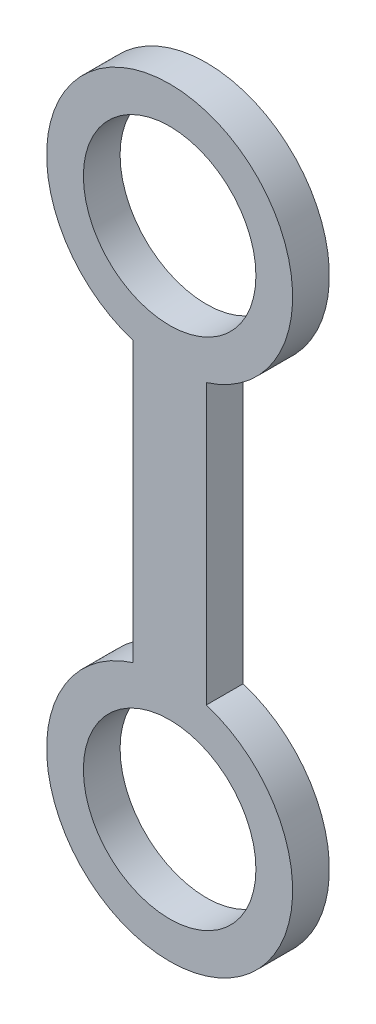
ISO-10303-21;
HEADER;
FILE_DESCRIPTION(('STEP AP214'),'2;1');
FILE_NAME('part.step','',(''),(''),'','','');
FILE_SCHEMA(('AUTOMOTIVE_DESIGN { 1 0 10303 214 1 1 1 1 }'));
ENDSEC;
DATA;
#1=APPLICATION_CONTEXT('core data for automotive mechanical design processes');
#2=APPLICATION_PROTOCOL_DEFINITION('international standard','automotive_design',2000,#1);
#3=PRODUCT_CONTEXT('',#1,'mechanical');
#4=PRODUCT('Part','Part','',(#3));
#5=PRODUCT_RELATED_PRODUCT_CATEGORY('part','',(#4));
#6=PRODUCT_DEFINITION_FORMATION('','',#4);
#7=PRODUCT_DEFINITION_CONTEXT('part definition',#1,'design');
#8=PRODUCT_DEFINITION('design','',#6,#7);
#9=PRODUCT_DEFINITION_SHAPE('','',#8);
#10=(LENGTH_UNIT() NAMED_UNIT(*) SI_UNIT(.MILLI.,.METRE.));
#11=(NAMED_UNIT(*) PLANE_ANGLE_UNIT() SI_UNIT($,.RADIAN.));
#12=(NAMED_UNIT(*) SI_UNIT($,.STERADIAN.) SOLID_ANGLE_UNIT());
#13=UNCERTAINTY_MEASURE_WITH_UNIT(LENGTH_MEASURE(1.E-05),#10,'distance_accuracy_value','');
#14=(GEOMETRIC_REPRESENTATION_CONTEXT(3) GLOBAL_UNCERTAINTY_ASSIGNED_CONTEXT((#13)) GLOBAL_UNIT_ASSIGNED_CONTEXT((#10,
#11,#12)) REPRESENTATION_CONTEXT('',''));
#15=CARTESIAN_POINT('',(0.,0.,0.));
#16=DIRECTION('',(0.,0.,1.));
#17=DIRECTION('',(1.,0.,0.));
#18=AXIS2_PLACEMENT_3D('',#15,#16,#17);
#19=CARTESIAN_POINT('',(0.,140.,10.));
#20=DIRECTION('',(0.,0.,-1.));
#21=DIRECTION('',(-1.,0.,0.));
#22=AXIS2_PLACEMENT_3D('',#19,#20,#21);
#23=PLANE('',#22);
#24=CARTESIAN_POINT('',(0.,0.,10.));
#25=DIRECTION('',(0.,0.,1.));
#26=DIRECTION('',(1.,0.,0.));
#27=AXIS2_PLACEMENT_3D('',#24,#25,#26);
#28=CIRCLE('',#27,23.5);
#29=CARTESIAN_POINT('',(23.5,0.,10.));
#30=VERTEX_POINT('',#29);
#31=EDGE_CURVE('E102',#30,#30,#28,.T.);
#32=ORIENTED_EDGE('',*,*,#31,.F.);
#33=EDGE_LOOP('',(#32));
#34=FACE_BOUND('',#33,.T.);
#35=CARTESIAN_POINT('',(0.,140.,10.));
#36=DIRECTION('',(0.,0.,1.));
#37=DIRECTION('',(-1.,0.,0.));
#38=AXIS2_PLACEMENT_3D('',#35,#36,#37);
#39=CIRCLE('',#38,33.5);
#40=CARTESIAN_POINT('',(10.,108.027355442504,10.));
#41=VERTEX_POINT('',#40);
#42=CARTESIAN_POINT('',(-9.99999999999996,108.027355442504,10.));
#43=VERTEX_POINT('',#42);
#44=EDGE_CURVE('E87',#41,#43,#39,.T.);
#45=ORIENTED_EDGE('',*,*,#44,.T.);
#46=DIRECTION('',(0.,-1.,0.));
#47=VECTOR('',#46,1.);
#48=CARTESIAN_POINT('',(-9.99999999999996,108.027355442504,10.));
#49=LINE('',#48,#47);
#50=CARTESIAN_POINT('',(-9.99999999999995,31.9726445574964,10.));
#51=VERTEX_POINT('',#50);
#52=EDGE_CURVE('E82',#43,#51,#49,.T.);
#53=ORIENTED_EDGE('',*,*,#52,.T.);
#54=CARTESIAN_POINT('',(0.,0.,10.));
#55=DIRECTION('',(0.,0.,1.));
#56=DIRECTION('',(1.,0.,0.));
#57=AXIS2_PLACEMENT_3D('',#54,#55,#56);
#58=CIRCLE('',#57,33.5);
#59=CARTESIAN_POINT('',(10.,31.9726445574963,10.));
#60=VERTEX_POINT('',#59);
#61=EDGE_CURVE('E85',#51,#60,#58,.T.);
#62=ORIENTED_EDGE('',*,*,#61,.T.);
#63=DIRECTION('',(0.,1.,0.));
#64=VECTOR('',#63,1.);
#65=CARTESIAN_POINT('',(10.,108.027355442504,10.));
#66=LINE('',#65,#64);
#67=EDGE_CURVE('E52',#60,#41,#66,.T.);
#68=ORIENTED_EDGE('',*,*,#67,.T.);
#69=EDGE_LOOP('',(#45,#53,#62,#68));
#70=FACE_BOUND('',#69,.T.);
#71=CARTESIAN_POINT('',(0.,140.,10.));
#72=DIRECTION('',(0.,0.,1.));
#73=DIRECTION('',(1.,0.,0.));
#74=AXIS2_PLACEMENT_3D('',#71,#72,#73);
#75=CIRCLE('',#74,23.5);
#76=CARTESIAN_POINT('',(23.5,140.,10.));
#77=VERTEX_POINT('',#76);
#78=EDGE_CURVE('E117',#77,#77,#75,.T.);
#79=ORIENTED_EDGE('',*,*,#78,.F.);
#80=EDGE_LOOP('',(#79));
#81=FACE_BOUND('',#80,.T.);
#82=ADVANCED_FACE('F35',(#34,#70,#81),#23,.F.);
#83=CARTESIAN_POINT('',(0.,140.,0.));
#84=DIRECTION('',(0.,0.,-1.));
#85=DIRECTION('',(-1.,0.,0.));
#86=AXIS2_PLACEMENT_3D('',#83,#84,#85);
#87=PLANE('',#86);
#88=CARTESIAN_POINT('',(0.,0.,0.));
#89=DIRECTION('',(0.,0.,1.));
#90=DIRECTION('',(1.,0.,0.));
#91=AXIS2_PLACEMENT_3D('',#88,#89,#90);
#92=CIRCLE('',#91,23.5);
#93=CARTESIAN_POINT('',(23.5,0.,0.));
#94=VERTEX_POINT('',#93);
#95=EDGE_CURVE('E114',#94,#94,#92,.T.);
#96=ORIENTED_EDGE('',*,*,#95,.T.);
#97=EDGE_LOOP('',(#96));
#98=FACE_BOUND('',#97,.T.);
#99=CARTESIAN_POINT('',(0.,140.,0.));
#100=DIRECTION('',(0.,0.,1.));
#101=DIRECTION('',(-1.,0.,0.));
#102=AXIS2_PLACEMENT_3D('',#99,#100,#101);
#103=CIRCLE('',#102,33.5);
#104=CARTESIAN_POINT('',(10.,108.027355442504,0.));
#105=VERTEX_POINT('',#104);
#106=CARTESIAN_POINT('',(-9.99999999999996,108.027355442504,0.));
#107=VERTEX_POINT('',#106);
#108=EDGE_CURVE('E99',#105,#107,#103,.T.);
#109=ORIENTED_EDGE('',*,*,#108,.F.);
#110=DIRECTION('',(0.,1.,0.));
#111=VECTOR('',#110,1.);
#112=CARTESIAN_POINT('',(10.,108.027355442504,0.));
#113=LINE('',#112,#111);
#114=CARTESIAN_POINT('',(10.,31.9726445574963,0.));
#115=VERTEX_POINT('',#114);
#116=EDGE_CURVE('E75',#115,#105,#113,.T.);
#117=ORIENTED_EDGE('',*,*,#116,.F.);
#118=CARTESIAN_POINT('',(0.,0.,0.));
#119=DIRECTION('',(0.,0.,1.));
#120=DIRECTION('',(1.,0.,0.));
#121=AXIS2_PLACEMENT_3D('',#118,#119,#120);
#122=CIRCLE('',#121,33.5);
#123=CARTESIAN_POINT('',(-9.99999999999995,31.9726445574964,0.));
#124=VERTEX_POINT('',#123);
#125=EDGE_CURVE('E69',#124,#115,#122,.T.);
#126=ORIENTED_EDGE('',*,*,#125,.F.);
#127=DIRECTION('',(0.,-1.,0.));
#128=VECTOR('',#127,1.);
#129=CARTESIAN_POINT('',(-9.99999999999996,108.027355442504,0.));
#130=LINE('',#129,#128);
#131=EDGE_CURVE('E91',#107,#124,#130,.T.);
#132=ORIENTED_EDGE('',*,*,#131,.F.);
#133=EDGE_LOOP('',(#109,#117,#126,#132));
#134=FACE_BOUND('',#133,.T.);
#135=CARTESIAN_POINT('',(0.,140.,0.));
#136=DIRECTION('',(0.,0.,1.));
#137=DIRECTION('',(1.,0.,0.));
#138=AXIS2_PLACEMENT_3D('',#135,#136,#137);
#139=CIRCLE('',#138,23.5);
#140=CARTESIAN_POINT('',(23.5,140.,0.));
#141=VERTEX_POINT('',#140);
#142=EDGE_CURVE('E120',#141,#141,#139,.T.);
#143=ORIENTED_EDGE('',*,*,#142,.T.);
#144=EDGE_LOOP('',(#143));
#145=FACE_BOUND('',#144,.T.);
#146=ADVANCED_FACE('F110',(#98,#134,#145),#87,.T.);
#147=CARTESIAN_POINT('',(0.,140.,10.));
#148=DIRECTION('',(0.,0.,-1.));
#149=DIRECTION('',(-1.,0.,0.));
#150=AXIS2_PLACEMENT_3D('',#147,#148,#149);
#151=CYLINDRICAL_SURFACE('',#150,33.5);
#152=ORIENTED_EDGE('',*,*,#108,.T.);
#153=DIRECTION('',(0.,0.,-1.));
#154=VECTOR('',#153,1.);
#155=CARTESIAN_POINT('',(-9.99999999999996,108.027355442504,10.));
#156=LINE('',#155,#154);
#157=EDGE_CURVE('E11',#43,#107,#156,.T.);
#158=ORIENTED_EDGE('',*,*,#157,.F.);
#159=ORIENTED_EDGE('',*,*,#44,.F.);
#160=DIRECTION('',(0.,0.,-1.));
#161=VECTOR('',#160,1.);
#162=CARTESIAN_POINT('',(10.,108.027355442504,10.));
#163=LINE('',#162,#161);
#164=EDGE_CURVE('E95',#41,#105,#163,.T.);
#165=ORIENTED_EDGE('',*,*,#164,.T.);
#166=EDGE_LOOP('',(#152,#158,#159,#165));
#167=FACE_BOUND('',#166,.T.);
#168=ADVANCED_FACE('F37',(#167),#151,.T.);
#169=CARTESIAN_POINT('',(-9.99999999999996,108.027355442504,10.));
#170=DIRECTION('',(1.,0.,0.));
#171=DIRECTION('',(0.,1.,0.));
#172=AXIS2_PLACEMENT_3D('',#169,#170,#171);
#173=PLANE('',#172);
#174=ORIENTED_EDGE('',*,*,#131,.T.);
#175=DIRECTION('',(0.,0.,-1.));
#176=VECTOR('',#175,1.);
#177=CARTESIAN_POINT('',(-9.99999999999995,31.9726445574964,10.));
#178=LINE('',#177,#176);
#179=EDGE_CURVE('E44',#51,#124,#178,.T.);
#180=ORIENTED_EDGE('',*,*,#179,.F.);
#181=ORIENTED_EDGE('',*,*,#52,.F.);
#182=ORIENTED_EDGE('',*,*,#157,.T.);
#183=EDGE_LOOP('',(#174,#180,#181,#182));
#184=FACE_BOUND('',#183,.T.);
#185=ADVANCED_FACE('F90',(#184),#173,.F.);
#186=CARTESIAN_POINT('',(0.,0.,10.));
#187=DIRECTION('',(0.,0.,-1.));
#188=DIRECTION('',(-1.,0.,0.));
#189=AXIS2_PLACEMENT_3D('',#186,#187,#188);
#190=CYLINDRICAL_SURFACE('',#189,33.5);
#191=ORIENTED_EDGE('',*,*,#125,.T.);
#192=DIRECTION('',(0.,0.,-1.));
#193=VECTOR('',#192,1.);
#194=CARTESIAN_POINT('',(10.,31.9726445574963,10.));
#195=LINE('',#194,#193);
#196=EDGE_CURVE('E92',#60,#115,#195,.T.);
#197=ORIENTED_EDGE('',*,*,#196,.F.);
#198=ORIENTED_EDGE('',*,*,#61,.F.);
#199=ORIENTED_EDGE('',*,*,#179,.T.);
#200=EDGE_LOOP('',(#191,#197,#198,#199));
#201=FACE_BOUND('',#200,.T.);
#202=ADVANCED_FACE('F93',(#201),#190,.T.);
#203=CARTESIAN_POINT('',(10.,108.027355442504,10.));
#204=DIRECTION('',(-1.,0.,0.));
#205=DIRECTION('',(0.,-1.,0.));
#206=AXIS2_PLACEMENT_3D('',#203,#204,#205);
#207=PLANE('',#206);
#208=ORIENTED_EDGE('',*,*,#116,.T.);
#209=ORIENTED_EDGE('',*,*,#164,.F.);
#210=ORIENTED_EDGE('',*,*,#67,.F.);
#211=ORIENTED_EDGE('',*,*,#196,.T.);
#212=EDGE_LOOP('',(#208,#209,#210,#211));
#213=FACE_BOUND('',#212,.T.);
#214=ADVANCED_FACE('F107',(#213),#207,.F.);
#215=CARTESIAN_POINT('',(0.,0.,10.));
#216=DIRECTION('',(0.,0.,-1.));
#217=DIRECTION('',(-1.,0.,0.));
#218=AXIS2_PLACEMENT_3D('',#215,#216,#217);
#219=CYLINDRICAL_SURFACE('',#218,23.5);
#220=ORIENTED_EDGE('',*,*,#31,.T.);
#221=EDGE_LOOP('',(#220));
#222=FACE_BOUND('',#221,.T.);
#223=ORIENTED_EDGE('',*,*,#95,.F.);
#224=EDGE_LOOP('',(#223));
#225=FACE_BOUND('',#224,.T.);
#226=ADVANCED_FACE('F138',(#222,#225),#219,.F.);
#227=CARTESIAN_POINT('',(0.,140.,10.));
#228=DIRECTION('',(0.,0.,-1.));
#229=DIRECTION('',(-1.,0.,0.));
#230=AXIS2_PLACEMENT_3D('',#227,#228,#229);
#231=CYLINDRICAL_SURFACE('',#230,23.5);
#232=ORIENTED_EDGE('',*,*,#78,.T.);
#233=EDGE_LOOP('',(#232));
#234=FACE_BOUND('',#233,.T.);
#235=ORIENTED_EDGE('',*,*,#142,.F.);
#236=EDGE_LOOP('',(#235));
#237=FACE_BOUND('',#236,.T.);
#238=ADVANCED_FACE('F126',(#234,#237),#231,.F.);
#239=CLOSED_SHELL('',(#82,#146,#168,#185,#202,#214,#226,#238));
#240=MANIFOLD_SOLID_BREP('B2',#239);
#241=ADVANCED_BREP_SHAPE_REPRESENTATION('',(#18,#240),#14);
#242=SHAPE_DEFINITION_REPRESENTATION(#9,#241);
ENDSEC;
END-ISO-10303-21;
